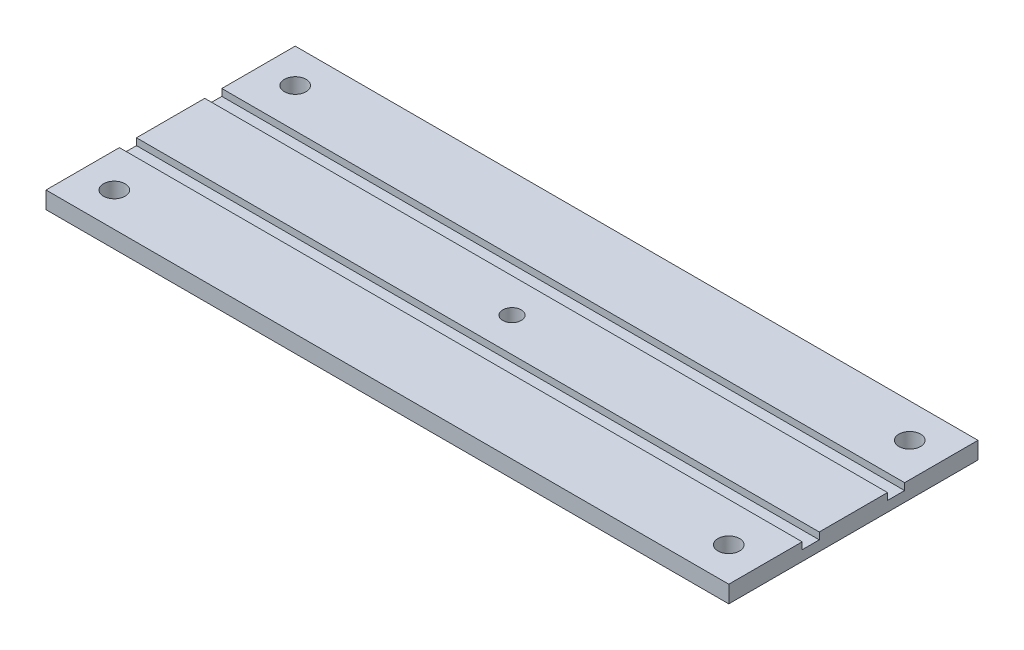
ISO-10303-21;
HEADER;
FILE_DESCRIPTION(('STEP AP214'),'2;1');
FILE_NAME('part.step','',(''),(''),'','','');
FILE_SCHEMA(('AUTOMOTIVE_DESIGN { 1 0 10303 214 1 1 1 1 }'));
ENDSEC;
DATA;
#1=APPLICATION_CONTEXT('core data for automotive mechanical design processes');
#2=APPLICATION_PROTOCOL_DEFINITION('international standard','automotive_design',2000,#1);
#3=PRODUCT_CONTEXT('',#1,'mechanical');
#4=PRODUCT('Part','Part','',(#3));
#5=PRODUCT_RELATED_PRODUCT_CATEGORY('part','',(#4));
#6=PRODUCT_DEFINITION_FORMATION('','',#4);
#7=PRODUCT_DEFINITION_CONTEXT('part definition',#1,'design');
#8=PRODUCT_DEFINITION('design','',#6,#7);
#9=PRODUCT_DEFINITION_SHAPE('','',#8);
#10=(LENGTH_UNIT() NAMED_UNIT(*) SI_UNIT(.MILLI.,.METRE.));
#11=(NAMED_UNIT(*) PLANE_ANGLE_UNIT() SI_UNIT($,.RADIAN.));
#12=(NAMED_UNIT(*) SI_UNIT($,.STERADIAN.) SOLID_ANGLE_UNIT());
#13=UNCERTAINTY_MEASURE_WITH_UNIT(LENGTH_MEASURE(1.E-05),#10,'distance_accuracy_value','');
#14=(GEOMETRIC_REPRESENTATION_CONTEXT(3) GLOBAL_UNCERTAINTY_ASSIGNED_CONTEXT((#13)) GLOBAL_UNIT_ASSIGNED_CONTEXT((#10,
#11,#12)) REPRESENTATION_CONTEXT('',''));
#15=CARTESIAN_POINT('',(0.,0.,0.));
#16=DIRECTION('',(0.,0.,1.));
#17=DIRECTION('',(1.,0.,0.));
#18=AXIS2_PLACEMENT_3D('',#15,#16,#17);
#19=CARTESIAN_POINT('',(0.,5.,0.));
#20=DIRECTION('',(0.,-1.,0.));
#21=DIRECTION('',(0.,0.,-1.));
#22=AXIS2_PLACEMENT_3D('',#19,#20,#21);
#23=PLANE('',#22);
#24=CARTESIAN_POINT('',(10.,5.,-10.));
#25=DIRECTION('',(0.,-1.,0.));
#26=DIRECTION('',(0.,0.,-1.));
#27=AXIS2_PLACEMENT_3D('',#24,#25,#26);
#28=CIRCLE('',#27,3.175);
#29=CARTESIAN_POINT('',(10.,5.,-13.175));
#30=VERTEX_POINT('',#29);
#31=EDGE_CURVE('E182',#30,#30,#28,.T.);
#32=ORIENTED_EDGE('',*,*,#31,.T.);
#33=EDGE_LOOP('',(#32));
#34=FACE_BOUND('',#33,.T.);
#35=CARTESIAN_POINT('',(190.,5.,-10.));
#36=DIRECTION('',(0.,-1.,0.));
#37=DIRECTION('',(0.,0.,-1.));
#38=AXIS2_PLACEMENT_3D('',#35,#36,#37);
#39=CIRCLE('',#38,3.17499999999998);
#40=CARTESIAN_POINT('',(190.,5.,-13.175));
#41=VERTEX_POINT('',#40);
#42=EDGE_CURVE('E200',#41,#41,#39,.T.);
#43=ORIENTED_EDGE('',*,*,#42,.T.);
#44=EDGE_LOOP('',(#43));
#45=FACE_BOUND('',#44,.T.);
#46=DIRECTION('',(0.,0.,-1.));
#47=VECTOR('',#46,1.);
#48=CARTESIAN_POINT('',(200.,5.,0.));
#49=LINE('',#48,#47);
#50=CARTESIAN_POINT('',(200.,5.,0.));
#51=VERTEX_POINT('',#50);
#52=CARTESIAN_POINT('',(200.,5.,-21.5));
#53=VERTEX_POINT('',#52);
#54=EDGE_CURVE('E212',#51,#53,#49,.T.);
#55=ORIENTED_EDGE('',*,*,#54,.T.);
#56=DIRECTION('',(1.,0.,0.));
#57=VECTOR('',#56,1.);
#58=CARTESIAN_POINT('',(200.,5.,-21.5));
#59=LINE('',#58,#57);
#60=CARTESIAN_POINT('',(0.,5.,-21.5));
#61=VERTEX_POINT('',#60);
#62=EDGE_CURVE('E136',#61,#53,#59,.T.);
#63=ORIENTED_EDGE('',*,*,#62,.F.);
#64=DIRECTION('',(0.,0.,1.));
#65=VECTOR('',#64,1.);
#66=CARTESIAN_POINT('',(0.,5.,0.));
#67=LINE('',#66,#65);
#68=CARTESIAN_POINT('',(0.,5.,0.));
#69=VERTEX_POINT('',#68);
#70=EDGE_CURVE('E209',#61,#69,#67,.T.);
#71=ORIENTED_EDGE('',*,*,#70,.T.);
#72=DIRECTION('',(1.,0.,0.));
#73=VECTOR('',#72,1.);
#74=CARTESIAN_POINT('',(0.,5.,0.));
#75=LINE('',#74,#73);
#76=EDGE_CURVE('E207',#69,#51,#75,.T.);
#77=ORIENTED_EDGE('',*,*,#76,.T.);
#78=EDGE_LOOP('',(#55,#63,#71,#77));
#79=FACE_BOUND('',#78,.T.);
#80=ADVANCED_FACE('F32',(#34,#45,#79),#23,.F.);
#81=CARTESIAN_POINT('',(100.,5.,-36.5));
#82=DIRECTION('',(0.,-1.,0.));
#83=DIRECTION('',(0.,0.,-1.));
#84=AXIS2_PLACEMENT_3D('',#81,#82,#83);
#85=CIRCLE('',#84,2.7051);
#86=CARTESIAN_POINT('',(100.,5.,-39.2051));
#87=VERTEX_POINT('',#86);
#88=EDGE_CURVE('E176',#87,#87,#85,.T.);
#89=ORIENTED_EDGE('',*,*,#88,.T.);
#90=EDGE_LOOP('',(#89));
#91=FACE_BOUND('',#90,.T.);
#92=CARTESIAN_POINT('',(0.,5.,-46.5));
#93=VERTEX_POINT('',#92);
#94=CARTESIAN_POINT('',(0.,5.,-26.5));
#95=VERTEX_POINT('',#94);
#96=EDGE_CURVE('E208',#93,#95,#67,.T.);
#97=ORIENTED_EDGE('',*,*,#96,.T.);
#98=DIRECTION('',(-1.,0.,0.));
#99=VECTOR('',#98,1.);
#100=CARTESIAN_POINT('',(200.,5.,-26.5));
#101=LINE('',#100,#99);
#102=CARTESIAN_POINT('',(200.,5.,-26.5));
#103=VERTEX_POINT('',#102);
#104=EDGE_CURVE('E258',#103,#95,#101,.T.);
#105=ORIENTED_EDGE('',*,*,#104,.F.);
#106=CARTESIAN_POINT('',(200.,5.,-46.5));
#107=VERTEX_POINT('',#106);
#108=EDGE_CURVE('E141',#103,#107,#49,.T.);
#109=ORIENTED_EDGE('',*,*,#108,.T.);
#110=DIRECTION('',(1.,0.,0.));
#111=VECTOR('',#110,1.);
#112=CARTESIAN_POINT('',(200.,5.,-46.5));
#113=LINE('',#112,#111);
#114=EDGE_CURVE('E152',#93,#107,#113,.T.);
#115=ORIENTED_EDGE('',*,*,#114,.F.);
#116=EDGE_LOOP('',(#97,#105,#109,#115));
#117=FACE_BOUND('',#116,.T.);
#118=ADVANCED_FACE('F256',(#91,#117),#23,.F.);
#119=CARTESIAN_POINT('',(0.,5.,0.));
#120=DIRECTION('',(1.,0.,0.));
#121=DIRECTION('',(0.,0.,-1.));
#122=AXIS2_PLACEMENT_3D('',#119,#120,#121);
#123=PLANE('',#122);
#124=ORIENTED_EDGE('',*,*,#70,.F.);
#125=DIRECTION('',(0.,1.,0.));
#126=VECTOR('',#125,1.);
#127=CARTESIAN_POINT('',(0.,3.,-21.5));
#128=LINE('',#127,#126);
#129=CARTESIAN_POINT('',(0.,3.,-21.5));
#130=VERTEX_POINT('',#129);
#131=EDGE_CURVE('E143',#130,#61,#128,.T.);
#132=ORIENTED_EDGE('',*,*,#131,.F.);
#133=DIRECTION('',(0.,0.,1.));
#134=VECTOR('',#133,1.);
#135=CARTESIAN_POINT('',(0.,3.,-21.5));
#136=LINE('',#135,#134);
#137=CARTESIAN_POINT('',(0.,3.,-26.5));
#138=VERTEX_POINT('',#137);
#139=EDGE_CURVE('E129',#138,#130,#136,.T.);
#140=ORIENTED_EDGE('',*,*,#139,.F.);
#141=DIRECTION('',(0.,1.,0.));
#142=VECTOR('',#141,1.);
#143=CARTESIAN_POINT('',(0.,3.,-26.5));
#144=LINE('',#143,#142);
#145=EDGE_CURVE('E127',#138,#95,#144,.T.);
#146=ORIENTED_EDGE('',*,*,#145,.T.);
#147=ORIENTED_EDGE('',*,*,#96,.F.);
#148=DIRECTION('',(0.,1.,0.));
#149=VECTOR('',#148,1.);
#150=CARTESIAN_POINT('',(0.,3.,-46.5));
#151=LINE('',#150,#149);
#152=CARTESIAN_POINT('',(0.,3.,-46.5));
#153=VERTEX_POINT('',#152);
#154=EDGE_CURVE('E168',#153,#93,#151,.T.);
#155=ORIENTED_EDGE('',*,*,#154,.F.);
#156=DIRECTION('',(0.,0.,1.));
#157=VECTOR('',#156,1.);
#158=CARTESIAN_POINT('',(0.,3.,-51.5));
#159=LINE('',#158,#157);
#160=CARTESIAN_POINT('',(0.,3.,-51.5));
#161=VERTEX_POINT('',#160);
#162=EDGE_CURVE('E155',#161,#153,#159,.T.);
#163=ORIENTED_EDGE('',*,*,#162,.F.);
#164=DIRECTION('',(0.,1.,0.));
#165=VECTOR('',#164,1.);
#166=CARTESIAN_POINT('',(0.,3.,-51.5));
#167=LINE('',#166,#165);
#168=CARTESIAN_POINT('',(0.,5.,-51.5));
#169=VERTEX_POINT('',#168);
#170=EDGE_CURVE('E170',#161,#169,#167,.T.);
#171=ORIENTED_EDGE('',*,*,#170,.T.);
#172=CARTESIAN_POINT('',(0.,5.,-73.));
#173=VERTEX_POINT('',#172);
#174=EDGE_CURVE('E204',#173,#169,#67,.T.);
#175=ORIENTED_EDGE('',*,*,#174,.F.);
#176=DIRECTION('',(0.,-1.,0.));
#177=VECTOR('',#176,1.);
#178=CARTESIAN_POINT('',(0.,5.,-73.));
#179=LINE('',#178,#177);
#180=CARTESIAN_POINT('',(0.,0.,-73.));
#181=VERTEX_POINT('',#180);
#182=EDGE_CURVE('E217',#173,#181,#179,.T.);
#183=ORIENTED_EDGE('',*,*,#182,.T.);
#184=DIRECTION('',(0.,0.,1.));
#185=VECTOR('',#184,1.);
#186=CARTESIAN_POINT('',(0.,0.,0.));
#187=LINE('',#186,#185);
#188=CARTESIAN_POINT('',(0.,0.,0.));
#189=VERTEX_POINT('',#188);
#190=EDGE_CURVE('E203',#181,#189,#187,.T.);
#191=ORIENTED_EDGE('',*,*,#190,.T.);
#192=DIRECTION('',(0.,-1.,0.));
#193=VECTOR('',#192,1.);
#194=CARTESIAN_POINT('',(0.,5.,0.));
#195=LINE('',#194,#193);
#196=EDGE_CURVE('E11',#69,#189,#195,.T.);
#197=ORIENTED_EDGE('',*,*,#196,.F.);
#198=EDGE_LOOP('',(#124,#132,#140,#146,#147,#155,#163,#171,#175,#183,#191,#197));
#199=FACE_BOUND('',#198,.T.);
#200=ADVANCED_FACE('F34',(#199),#123,.F.);
#201=CARTESIAN_POINT('',(0.,5.,0.));
#202=DIRECTION('',(0.,0.,-1.));
#203=DIRECTION('',(-1.,0.,0.));
#204=AXIS2_PLACEMENT_3D('',#201,#202,#203);
#205=PLANE('',#204);
#206=DIRECTION('',(1.,0.,0.));
#207=VECTOR('',#206,1.);
#208=CARTESIAN_POINT('',(0.,0.,0.));
#209=LINE('',#208,#207);
#210=CARTESIAN_POINT('',(200.,0.,0.));
#211=VERTEX_POINT('',#210);
#212=EDGE_CURVE('E220',#189,#211,#209,.T.);
#213=ORIENTED_EDGE('',*,*,#212,.T.);
#214=DIRECTION('',(0.,-1.,0.));
#215=VECTOR('',#214,1.);
#216=CARTESIAN_POINT('',(200.,5.,0.));
#217=LINE('',#216,#215);
#218=EDGE_CURVE('E40',#51,#211,#217,.T.);
#219=ORIENTED_EDGE('',*,*,#218,.F.);
#220=ORIENTED_EDGE('',*,*,#76,.F.);
#221=ORIENTED_EDGE('',*,*,#196,.T.);
#222=EDGE_LOOP('',(#213,#219,#220,#221));
#223=FACE_BOUND('',#222,.T.);
#224=ADVANCED_FACE('F269',(#223),#205,.F.);
#225=CARTESIAN_POINT('',(200.,5.,0.));
#226=DIRECTION('',(-1.,0.,0.));
#227=DIRECTION('',(0.,0.,1.));
#228=AXIS2_PLACEMENT_3D('',#225,#226,#227);
#229=PLANE('',#228);
#230=DIRECTION('',(0.,0.,-1.));
#231=VECTOR('',#230,1.);
#232=CARTESIAN_POINT('',(200.,3.,-21.5));
#233=LINE('',#232,#231);
#234=CARTESIAN_POINT('',(200.,3.,-21.5));
#235=VERTEX_POINT('',#234);
#236=CARTESIAN_POINT('',(200.,3.,-26.5));
#237=VERTEX_POINT('',#236);
#238=EDGE_CURVE('E130',#235,#237,#233,.T.);
#239=ORIENTED_EDGE('',*,*,#238,.F.);
#240=DIRECTION('',(0.,1.,0.));
#241=VECTOR('',#240,1.);
#242=CARTESIAN_POINT('',(200.,3.,-21.5));
#243=LINE('',#242,#241);
#244=EDGE_CURVE('E162',#235,#53,#243,.T.);
#245=ORIENTED_EDGE('',*,*,#244,.T.);
#246=ORIENTED_EDGE('',*,*,#54,.F.);
#247=ORIENTED_EDGE('',*,*,#218,.T.);
#248=DIRECTION('',(0.,0.,-1.));
#249=VECTOR('',#248,1.);
#250=CARTESIAN_POINT('',(200.,0.,0.));
#251=LINE('',#250,#249);
#252=CARTESIAN_POINT('',(200.,0.,-73.));
#253=VERTEX_POINT('',#252);
#254=EDGE_CURVE('E222',#211,#253,#251,.T.);
#255=ORIENTED_EDGE('',*,*,#254,.T.);
#256=DIRECTION('',(0.,-1.,0.));
#257=VECTOR('',#256,1.);
#258=CARTESIAN_POINT('',(200.,5.,-73.));
#259=LINE('',#258,#257);
#260=CARTESIAN_POINT('',(200.,5.,-73.));
#261=VERTEX_POINT('',#260);
#262=EDGE_CURVE('E228',#261,#253,#259,.T.);
#263=ORIENTED_EDGE('',*,*,#262,.F.);
#264=CARTESIAN_POINT('',(200.,5.,-51.5));
#265=VERTEX_POINT('',#264);
#266=EDGE_CURVE('E211',#265,#261,#49,.T.);
#267=ORIENTED_EDGE('',*,*,#266,.F.);
#268=DIRECTION('',(0.,1.,0.));
#269=VECTOR('',#268,1.);
#270=CARTESIAN_POINT('',(200.,3.,-51.5));
#271=LINE('',#270,#269);
#272=CARTESIAN_POINT('',(200.,3.,-51.5));
#273=VERTEX_POINT('',#272);
#274=EDGE_CURVE('E55',#273,#265,#271,.T.);
#275=ORIENTED_EDGE('',*,*,#274,.F.);
#276=DIRECTION('',(0.,0.,-1.));
#277=VECTOR('',#276,1.);
#278=CARTESIAN_POINT('',(200.,3.,-51.5));
#279=LINE('',#278,#277);
#280=CARTESIAN_POINT('',(200.,3.,-46.5));
#281=VERTEX_POINT('',#280);
#282=EDGE_CURVE('E148',#281,#273,#279,.T.);
#283=ORIENTED_EDGE('',*,*,#282,.F.);
#284=DIRECTION('',(0.,1.,0.));
#285=VECTOR('',#284,1.);
#286=CARTESIAN_POINT('',(200.,3.,-46.5));
#287=LINE('',#286,#285);
#288=EDGE_CURVE('E165',#281,#107,#287,.T.);
#289=ORIENTED_EDGE('',*,*,#288,.T.);
#290=ORIENTED_EDGE('',*,*,#108,.F.);
#291=DIRECTION('',(0.,1.,0.));
#292=VECTOR('',#291,1.);
#293=CARTESIAN_POINT('',(200.,3.,-26.5));
#294=LINE('',#293,#292);
#295=EDGE_CURVE('E124',#237,#103,#294,.T.);
#296=ORIENTED_EDGE('',*,*,#295,.F.);
#297=EDGE_LOOP('',(#239,#245,#246,#247,#255,#263,#267,#275,#283,#289,#290,#296));
#298=FACE_BOUND('',#297,.T.);
#299=ADVANCED_FACE('F139',(#298),#229,.F.);
#300=CARTESIAN_POINT('',(0.,5.,-73.));
#301=DIRECTION('',(0.,0.,1.));
#302=DIRECTION('',(1.,0.,0.));
#303=AXIS2_PLACEMENT_3D('',#300,#301,#302);
#304=PLANE('',#303);
#305=DIRECTION('',(-1.,0.,0.));
#306=VECTOR('',#305,1.);
#307=CARTESIAN_POINT('',(0.,0.,-73.));
#308=LINE('',#307,#306);
#309=EDGE_CURVE('E224',#253,#181,#308,.T.);
#310=ORIENTED_EDGE('',*,*,#309,.T.);
#311=ORIENTED_EDGE('',*,*,#182,.F.);
#312=DIRECTION('',(-1.,0.,0.));
#313=VECTOR('',#312,1.);
#314=CARTESIAN_POINT('',(0.,5.,-73.));
#315=LINE('',#314,#313);
#316=EDGE_CURVE('E215',#261,#173,#315,.T.);
#317=ORIENTED_EDGE('',*,*,#316,.F.);
#318=ORIENTED_EDGE('',*,*,#262,.T.);
#319=EDGE_LOOP('',(#310,#311,#317,#318));
#320=FACE_BOUND('',#319,.T.);
#321=ADVANCED_FACE('F243',(#320),#304,.F.);
#322=CARTESIAN_POINT('',(10.,5.,-63.));
#323=DIRECTION('',(0.,-1.,0.));
#324=DIRECTION('',(0.,0.,-1.));
#325=AXIS2_PLACEMENT_3D('',#322,#323,#324);
#326=CIRCLE('',#325,3.175);
#327=CARTESIAN_POINT('',(10.,5.,-66.175));
#328=VERTEX_POINT('',#327);
#329=EDGE_CURVE('E188',#328,#328,#326,.T.);
#330=ORIENTED_EDGE('',*,*,#329,.T.);
#331=EDGE_LOOP('',(#330));
#332=FACE_BOUND('',#331,.T.);
#333=CARTESIAN_POINT('',(190.,5.,-63.));
#334=DIRECTION('',(0.,-1.,0.));
#335=DIRECTION('',(0.,0.,-1.));
#336=AXIS2_PLACEMENT_3D('',#333,#334,#335);
#337=CIRCLE('',#336,3.17499999999998);
#338=CARTESIAN_POINT('',(190.,5.,-66.175));
#339=VERTEX_POINT('',#338);
#340=EDGE_CURVE('E194',#339,#339,#337,.T.);
#341=ORIENTED_EDGE('',*,*,#340,.T.);
#342=EDGE_LOOP('',(#341));
#343=FACE_BOUND('',#342,.T.);
#344=ORIENTED_EDGE('',*,*,#174,.T.);
#345=DIRECTION('',(-1.,0.,0.));
#346=VECTOR('',#345,1.);
#347=CARTESIAN_POINT('',(200.,5.,-51.5));
#348=LINE('',#347,#346);
#349=EDGE_CURVE('E160',#265,#169,#348,.T.);
#350=ORIENTED_EDGE('',*,*,#349,.F.);
#351=ORIENTED_EDGE('',*,*,#266,.T.);
#352=ORIENTED_EDGE('',*,*,#316,.T.);
#353=EDGE_LOOP('',(#344,#350,#351,#352));
#354=FACE_BOUND('',#353,.T.);
#355=ADVANCED_FACE('F251',(#332,#343,#354),#23,.F.);
#356=CARTESIAN_POINT('',(0.,0.,0.));
#357=DIRECTION('',(0.,-1.,0.));
#358=DIRECTION('',(0.,0.,-1.));
#359=AXIS2_PLACEMENT_3D('',#356,#357,#358);
#360=PLANE('',#359);
#361=CARTESIAN_POINT('',(100.,0.,-36.5));
#362=DIRECTION('',(0.,-1.,0.));
#363=DIRECTION('',(0.,0.,-1.));
#364=AXIS2_PLACEMENT_3D('',#361,#362,#363);
#365=CIRCLE('',#364,2.7051);
#366=CARTESIAN_POINT('',(100.,0.,-39.2051));
#367=VERTEX_POINT('',#366);
#368=EDGE_CURVE('E167',#367,#367,#365,.T.);
#369=ORIENTED_EDGE('',*,*,#368,.F.);
#370=EDGE_LOOP('',(#369));
#371=FACE_BOUND('',#370,.T.);
#372=CARTESIAN_POINT('',(10.,0.,-10.));
#373=DIRECTION('',(0.,-1.,0.));
#374=DIRECTION('',(0.,0.,-1.));
#375=AXIS2_PLACEMENT_3D('',#372,#373,#374);
#376=CIRCLE('',#375,3.17499999999999);
#377=CARTESIAN_POINT('',(10.,0.,-13.175));
#378=VERTEX_POINT('',#377);
#379=EDGE_CURVE('E179',#378,#378,#376,.T.);
#380=ORIENTED_EDGE('',*,*,#379,.F.);
#381=EDGE_LOOP('',(#380));
#382=FACE_BOUND('',#381,.T.);
#383=CARTESIAN_POINT('',(10.,0.,-63.));
#384=DIRECTION('',(0.,-1.,0.));
#385=DIRECTION('',(0.,0.,-1.));
#386=AXIS2_PLACEMENT_3D('',#383,#384,#385);
#387=CIRCLE('',#386,3.17499999999999);
#388=CARTESIAN_POINT('',(10.,0.,-66.175));
#389=VERTEX_POINT('',#388);
#390=EDGE_CURVE('E185',#389,#389,#387,.T.);
#391=ORIENTED_EDGE('',*,*,#390,.F.);
#392=EDGE_LOOP('',(#391));
#393=FACE_BOUND('',#392,.T.);
#394=CARTESIAN_POINT('',(190.,0.,-63.));
#395=DIRECTION('',(0.,-1.,0.));
#396=DIRECTION('',(0.,0.,-1.));
#397=AXIS2_PLACEMENT_3D('',#394,#395,#396);
#398=CIRCLE('',#397,3.17499999999998);
#399=CARTESIAN_POINT('',(190.,0.,-66.175));
#400=VERTEX_POINT('',#399);
#401=EDGE_CURVE('E191',#400,#400,#398,.T.);
#402=ORIENTED_EDGE('',*,*,#401,.F.);
#403=EDGE_LOOP('',(#402));
#404=FACE_BOUND('',#403,.T.);
#405=CARTESIAN_POINT('',(190.,0.,-10.));
#406=DIRECTION('',(0.,-1.,0.));
#407=DIRECTION('',(0.,0.,-1.));
#408=AXIS2_PLACEMENT_3D('',#405,#406,#407);
#409=CIRCLE('',#408,3.17499999999998);
#410=CARTESIAN_POINT('',(190.,0.,-13.175));
#411=VERTEX_POINT('',#410);
#412=EDGE_CURVE('E197',#411,#411,#409,.T.);
#413=ORIENTED_EDGE('',*,*,#412,.F.);
#414=EDGE_LOOP('',(#413));
#415=FACE_BOUND('',#414,.T.);
#416=ORIENTED_EDGE('',*,*,#190,.F.);
#417=ORIENTED_EDGE('',*,*,#309,.F.);
#418=ORIENTED_EDGE('',*,*,#254,.F.);
#419=ORIENTED_EDGE('',*,*,#212,.F.);
#420=EDGE_LOOP('',(#416,#417,#418,#419));
#421=FACE_BOUND('',#420,.T.);
#422=ADVANCED_FACE('F240',(#371,#382,#393,#404,#415,#421),#360,.T.);
#423=CARTESIAN_POINT('',(190.,0.,-10.));
#424=DIRECTION('',(0.,-1.,0.));
#425=DIRECTION('',(0.,0.,-1.));
#426=AXIS2_PLACEMENT_3D('',#423,#424,#425);
#427=CYLINDRICAL_SURFACE('',#426,3.17499999999998);
#428=ORIENTED_EDGE('',*,*,#42,.F.);
#429=EDGE_LOOP('',(#428));
#430=FACE_BOUND('',#429,.T.);
#431=ORIENTED_EDGE('',*,*,#412,.T.);
#432=EDGE_LOOP('',(#431));
#433=FACE_BOUND('',#432,.T.);
#434=ADVANCED_FACE('F292',(#430,#433),#427,.F.);
#435=CARTESIAN_POINT('',(190.,0.,-63.));
#436=DIRECTION('',(0.,-1.,0.));
#437=DIRECTION('',(0.,0.,-1.));
#438=AXIS2_PLACEMENT_3D('',#435,#436,#437);
#439=CYLINDRICAL_SURFACE('',#438,3.17499999999998);
#440=ORIENTED_EDGE('',*,*,#340,.F.);
#441=EDGE_LOOP('',(#440));
#442=FACE_BOUND('',#441,.T.);
#443=ORIENTED_EDGE('',*,*,#401,.T.);
#444=EDGE_LOOP('',(#443));
#445=FACE_BOUND('',#444,.T.);
#446=ADVANCED_FACE('F299',(#442,#445),#439,.F.);
#447=CARTESIAN_POINT('',(10.,0.,-63.));
#448=DIRECTION('',(0.,-1.,0.));
#449=DIRECTION('',(0.,0.,-1.));
#450=AXIS2_PLACEMENT_3D('',#447,#448,#449);
#451=CYLINDRICAL_SURFACE('',#450,3.17499999999999);
#452=ORIENTED_EDGE('',*,*,#329,.F.);
#453=EDGE_LOOP('',(#452));
#454=FACE_BOUND('',#453,.T.);
#455=ORIENTED_EDGE('',*,*,#390,.T.);
#456=EDGE_LOOP('',(#455));
#457=FACE_BOUND('',#456,.T.);
#458=ADVANCED_FACE('F302',(#454,#457),#451,.F.);
#459=CARTESIAN_POINT('',(10.,0.,-10.));
#460=DIRECTION('',(0.,-1.,0.));
#461=DIRECTION('',(0.,0.,-1.));
#462=AXIS2_PLACEMENT_3D('',#459,#460,#461);
#463=CYLINDRICAL_SURFACE('',#462,3.17499999999999);
#464=ORIENTED_EDGE('',*,*,#31,.F.);
#465=EDGE_LOOP('',(#464));
#466=FACE_BOUND('',#465,.T.);
#467=ORIENTED_EDGE('',*,*,#379,.T.);
#468=EDGE_LOOP('',(#467));
#469=FACE_BOUND('',#468,.T.);
#470=ADVANCED_FACE('F317',(#466,#469),#463,.F.);
#471=CARTESIAN_POINT('',(100.,0.,-36.5));
#472=DIRECTION('',(0.,-1.,0.));
#473=DIRECTION('',(0.,0.,-1.));
#474=AXIS2_PLACEMENT_3D('',#471,#472,#473);
#475=CYLINDRICAL_SURFACE('',#474,2.7051);
#476=ORIENTED_EDGE('',*,*,#88,.F.);
#477=EDGE_LOOP('',(#476));
#478=FACE_BOUND('',#477,.T.);
#479=ORIENTED_EDGE('',*,*,#368,.T.);
#480=EDGE_LOOP('',(#479));
#481=FACE_BOUND('',#480,.T.);
#482=ADVANCED_FACE('F321',(#478,#481),#475,.F.);
#483=CARTESIAN_POINT('',(200.,3.,-46.5));
#484=DIRECTION('',(0.,0.,1.));
#485=DIRECTION('',(1.,0.,0.));
#486=AXIS2_PLACEMENT_3D('',#483,#484,#485);
#487=PLANE('',#486);
#488=ORIENTED_EDGE('',*,*,#114,.T.);
#489=ORIENTED_EDGE('',*,*,#288,.F.);
#490=DIRECTION('',(1.,0.,0.));
#491=VECTOR('',#490,1.);
#492=CARTESIAN_POINT('',(200.,3.,-46.5));
#493=LINE('',#492,#491);
#494=EDGE_CURVE('E157',#153,#281,#493,.T.);
#495=ORIENTED_EDGE('',*,*,#494,.F.);
#496=ORIENTED_EDGE('',*,*,#154,.T.);
#497=EDGE_LOOP('',(#488,#489,#495,#496));
#498=FACE_BOUND('',#497,.T.);
#499=ADVANCED_FACE('F260',(#498),#487,.F.);
#500=CARTESIAN_POINT('',(200.,3.,-51.5));
#501=DIRECTION('',(0.,0.,-1.));
#502=DIRECTION('',(-1.,0.,0.));
#503=AXIS2_PLACEMENT_3D('',#500,#501,#502);
#504=PLANE('',#503);
#505=ORIENTED_EDGE('',*,*,#349,.T.);
#506=ORIENTED_EDGE('',*,*,#170,.F.);
#507=DIRECTION('',(-1.,0.,0.));
#508=VECTOR('',#507,1.);
#509=CARTESIAN_POINT('',(200.,3.,-51.5));
#510=LINE('',#509,#508);
#511=EDGE_CURVE('E151',#273,#161,#510,.T.);
#512=ORIENTED_EDGE('',*,*,#511,.F.);
#513=ORIENTED_EDGE('',*,*,#274,.T.);
#514=EDGE_LOOP('',(#505,#506,#512,#513));
#515=FACE_BOUND('',#514,.T.);
#516=ADVANCED_FACE('F326',(#515),#504,.F.);
#517=CARTESIAN_POINT('',(0.,3.,0.));
#518=DIRECTION('',(0.,-1.,0.));
#519=DIRECTION('',(0.,0.,-1.));
#520=AXIS2_PLACEMENT_3D('',#517,#518,#519);
#521=PLANE('',#520);
#522=ORIENTED_EDGE('',*,*,#282,.T.);
#523=ORIENTED_EDGE('',*,*,#511,.T.);
#524=ORIENTED_EDGE('',*,*,#162,.T.);
#525=ORIENTED_EDGE('',*,*,#494,.T.);
#526=EDGE_LOOP('',(#522,#523,#524,#525));
#527=FACE_BOUND('',#526,.T.);
#528=ADVANCED_FACE('F265',(#527),#521,.F.);
#529=CARTESIAN_POINT('',(200.,3.,-21.5));
#530=DIRECTION('',(0.,0.,1.));
#531=DIRECTION('',(1.,0.,0.));
#532=AXIS2_PLACEMENT_3D('',#529,#530,#531);
#533=PLANE('',#532);
#534=ORIENTED_EDGE('',*,*,#62,.T.);
#535=ORIENTED_EDGE('',*,*,#244,.F.);
#536=DIRECTION('',(1.,0.,0.));
#537=VECTOR('',#536,1.);
#538=CARTESIAN_POINT('',(200.,3.,-21.5));
#539=LINE('',#538,#537);
#540=EDGE_CURVE('E47',#130,#235,#539,.T.);
#541=ORIENTED_EDGE('',*,*,#540,.F.);
#542=ORIENTED_EDGE('',*,*,#131,.T.);
#543=EDGE_LOOP('',(#534,#535,#541,#542));
#544=FACE_BOUND('',#543,.T.);
#545=ADVANCED_FACE('F333',(#544),#533,.F.);
#546=CARTESIAN_POINT('',(200.,3.,-26.5));
#547=DIRECTION('',(0.,0.,-1.));
#548=DIRECTION('',(-1.,0.,0.));
#549=AXIS2_PLACEMENT_3D('',#546,#547,#548);
#550=PLANE('',#549);
#551=ORIENTED_EDGE('',*,*,#104,.T.);
#552=ORIENTED_EDGE('',*,*,#145,.F.);
#553=DIRECTION('',(-1.,0.,0.));
#554=VECTOR('',#553,1.);
#555=CARTESIAN_POINT('',(200.,3.,-26.5));
#556=LINE('',#555,#554);
#557=EDGE_CURVE('E121',#237,#138,#556,.T.);
#558=ORIENTED_EDGE('',*,*,#557,.F.);
#559=ORIENTED_EDGE('',*,*,#295,.T.);
#560=EDGE_LOOP('',(#551,#552,#558,#559));
#561=FACE_BOUND('',#560,.T.);
#562=ADVANCED_FACE('F122',(#561),#550,.F.);
#563=CARTESIAN_POINT('',(0.,3.,0.));
#564=DIRECTION('',(0.,1.,0.));
#565=DIRECTION('',(0.,0.,1.));
#566=AXIS2_PLACEMENT_3D('',#563,#564,#565);
#567=PLANE('',#566);
#568=ORIENTED_EDGE('',*,*,#238,.T.);
#569=ORIENTED_EDGE('',*,*,#557,.T.);
#570=ORIENTED_EDGE('',*,*,#139,.T.);
#571=ORIENTED_EDGE('',*,*,#540,.T.);
#572=EDGE_LOOP('',(#568,#569,#570,#571));
#573=FACE_BOUND('',#572,.T.);
#574=ADVANCED_FACE('F133',(#573),#567,.T.);
#575=CLOSED_SHELL('',(#80,#118,#200,#224,#299,#321,#355,#422,#434,#446,#458,#470,#482,#499,#516,
#528,#545,#562,#574));
#576=MANIFOLD_SOLID_BREP('B2',#575);
#577=ADVANCED_BREP_SHAPE_REPRESENTATION('',(#18,#576),#14);
#578=SHAPE_DEFINITION_REPRESENTATION(#9,#577);
ENDSEC;
END-ISO-10303-21;
